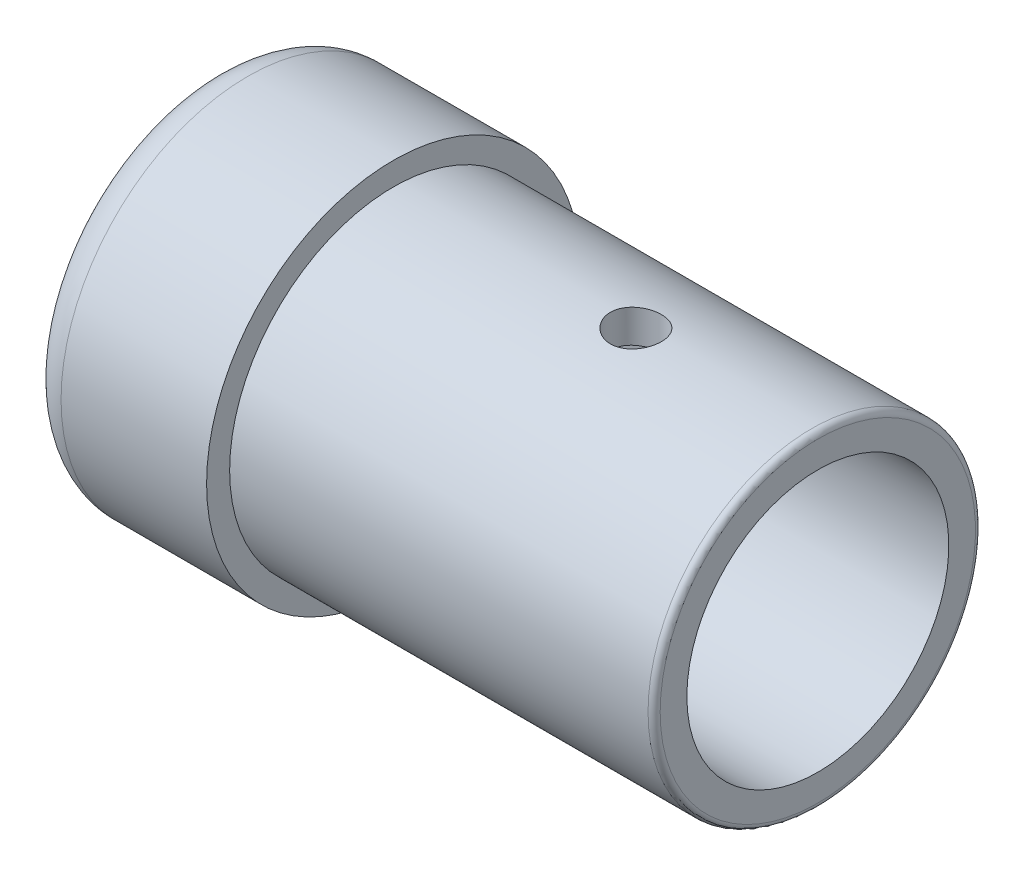
ISO-10303-21;
HEADER;
FILE_DESCRIPTION(('STEP AP214'),'2;1');
FILE_NAME('part.step','',(''),(''),'','','');
FILE_SCHEMA(('AUTOMOTIVE_DESIGN { 1 0 10303 214 1 1 1 1 }'));
ENDSEC;
DATA;
#1=APPLICATION_CONTEXT('core data for automotive mechanical design processes');
#2=APPLICATION_PROTOCOL_DEFINITION('international standard','automotive_design',2000,#1);
#3=PRODUCT_CONTEXT('',#1,'mechanical');
#4=PRODUCT('Part','Part','',(#3));
#5=PRODUCT_RELATED_PRODUCT_CATEGORY('part','',(#4));
#6=PRODUCT_DEFINITION_FORMATION('','',#4);
#7=PRODUCT_DEFINITION_CONTEXT('part definition',#1,'design');
#8=PRODUCT_DEFINITION('design','',#6,#7);
#9=PRODUCT_DEFINITION_SHAPE('','',#8);
#10=(LENGTH_UNIT() NAMED_UNIT(*) SI_UNIT(.MILLI.,.METRE.));
#11=(NAMED_UNIT(*) PLANE_ANGLE_UNIT() SI_UNIT($,.RADIAN.));
#12=(NAMED_UNIT(*) SI_UNIT($,.STERADIAN.) SOLID_ANGLE_UNIT());
#13=UNCERTAINTY_MEASURE_WITH_UNIT(LENGTH_MEASURE(1.E-05),#10,'distance_accuracy_value','');
#14=(GEOMETRIC_REPRESENTATION_CONTEXT(3) GLOBAL_UNCERTAINTY_ASSIGNED_CONTEXT((#13)) GLOBAL_UNIT_ASSIGNED_CONTEXT((#10,
#11,#12)) REPRESENTATION_CONTEXT('',''));
#15=CARTESIAN_POINT('',(0.,0.,0.));
#16=DIRECTION('',(0.,0.,1.));
#17=DIRECTION('',(1.,0.,0.));
#18=AXIS2_PLACEMENT_3D('',#15,#16,#17);
#19=CARTESIAN_POINT('',(0.,0.,0.));
#20=DIRECTION('',(-1.,0.,0.));
#21=DIRECTION('',(0.,0.,1.));
#22=AXIS2_PLACEMENT_3D('',#19,#20,#21);
#23=CYLINDRICAL_SURFACE('',#22,15.4);
#24=CARTESIAN_POINT('',(3.,0.,0.));
#25=DIRECTION('',(1.,0.,0.));
#26=DIRECTION('',(0.,0.,-1.));
#27=AXIS2_PLACEMENT_3D('',#24,#25,#26);
#28=CIRCLE('',#27,15.4);
#29=CARTESIAN_POINT('',(3.,0.,-15.4));
#30=VERTEX_POINT('',#29);
#31=EDGE_CURVE('E43',#30,#30,#28,.T.);
#32=ORIENTED_EDGE('',*,*,#31,.T.);
#33=EDGE_LOOP('',(#32));
#34=FACE_BOUND('',#33,.T.);
#35=CARTESIAN_POINT('',(15.,0.,0.));
#36=DIRECTION('',(-1.,0.,0.));
#37=DIRECTION('',(0.,0.,1.));
#38=AXIS2_PLACEMENT_3D('',#35,#36,#37);
#39=CIRCLE('',#38,15.4);
#40=CARTESIAN_POINT('',(15.,0.,15.4));
#41=VERTEX_POINT('',#40);
#42=EDGE_CURVE('E52',#41,#41,#39,.T.);
#43=ORIENTED_EDGE('',*,*,#42,.T.);
#44=EDGE_LOOP('',(#43));
#45=FACE_BOUND('',#44,.T.);
#46=ADVANCED_FACE('F32',(#34,#45),#23,.T.);
#47=CARTESIAN_POINT('',(15.,15.4,0.));
#48=DIRECTION('',(-1.,0.,0.));
#49=DIRECTION('',(0.,0.,1.));
#50=AXIS2_PLACEMENT_3D('',#47,#48,#49);
#51=PLANE('',#50);
#52=ORIENTED_EDGE('',*,*,#42,.F.);
#53=EDGE_LOOP('',(#52));
#54=FACE_BOUND('',#53,.T.);
#55=CARTESIAN_POINT('',(15.,0.,0.));
#56=DIRECTION('',(-1.,0.,0.));
#57=DIRECTION('',(0.,0.,1.));
#58=AXIS2_PLACEMENT_3D('',#55,#56,#57);
#59=CIRCLE('',#58,13.5);
#60=CARTESIAN_POINT('',(15.,0.,13.5));
#61=VERTEX_POINT('',#60);
#62=EDGE_CURVE('E120',#61,#61,#59,.T.);
#63=ORIENTED_EDGE('',*,*,#62,.T.);
#64=EDGE_LOOP('',(#63));
#65=FACE_BOUND('',#64,.T.);
#66=ADVANCED_FACE('F93',(#54,#65),#51,.F.);
#67=CARTESIAN_POINT('',(0.,0.,0.));
#68=DIRECTION('',(-1.,0.,0.));
#69=DIRECTION('',(0.,0.,1.));
#70=AXIS2_PLACEMENT_3D('',#67,#68,#69);
#71=CYLINDRICAL_SURFACE('',#70,13.5);
#72=CARTESIAN_POINT('',(49.5,0.,0.));
#73=DIRECTION('',(-1.,0.,0.));
#74=DIRECTION('',(0.,0.,1.));
#75=AXIS2_PLACEMENT_3D('',#72,#73,#74);
#76=CIRCLE('',#75,13.5);
#77=CARTESIAN_POINT('',(49.5,0.,13.5));
#78=VERTEX_POINT('',#77);
#79=EDGE_CURVE('E39',#78,#78,#76,.T.);
#80=ORIENTED_EDGE('',*,*,#79,.T.);
#81=EDGE_LOOP('',(#80));
#82=FACE_BOUND('',#81,.T.);
#83=CARTESIAN_POINT('',(35.,13.3356664625357,-2.1));
#84=CARTESIAN_POINT('',(35.117189735604,13.3356684764629,-2.09999519959793));
#85=CARTESIAN_POINT('',(35.2344462028055,13.3372279268675,-2.09015721642434));
#86=CARTESIAN_POINT('',(35.465677026657,13.3432925416161,-2.05107780489137));
#87=CARTESIAN_POINT('',(35.5796481288863,13.3478005286584,-2.02181778299226));
#88=CARTESIAN_POINT('',(35.8009279355127,13.3592395594915,-1.9447940892651));
#89=CARTESIAN_POINT('',(35.9082418218113,13.3661686901015,-1.89704502421322));
#90=CARTESIAN_POINT('',(36.1133205031741,13.3816670025326,-1.78443372291488));
#91=CARTESIAN_POINT('',(36.2110865330369,13.3902359718524,-1.71957370360874));
#92=CARTESIAN_POINT('',(36.3951492060818,13.4081308443291,-1.57398608279102));
#93=CARTESIAN_POINT('',(36.481351813448,13.4174620642089,-1.49314023241013));
#94=CARTESIAN_POINT('',(36.6390251600435,13.4357826645709,-1.31813128478761));
#95=CARTESIAN_POINT('',(36.7104950693196,13.4447720257716,-1.22396743779231));
#96=CARTESIAN_POINT('',(36.8370231944948,13.4614518932917,-1.02439074618979));
#97=CARTESIAN_POINT('',(36.89199450949,13.4691354327207,-0.918922176013068));
#98=CARTESIAN_POINT('',(36.9834070537758,13.4822789509612,-0.700109239269966));
#99=CARTESIAN_POINT('',(37.0198493345692,13.4877390559467,-0.586765320036194));
#100=CARTESIAN_POINT('',(37.072883439397,13.4957829827297,-0.356388621289866));
#101=CARTESIAN_POINT('',(37.0896329163649,13.4983896363778,-0.239392944572103));
#102=CARTESIAN_POINT('',(37.103295709732,13.5005112757695,-0.00422465874926388));
#103=CARTESIAN_POINT('',(37.1002102079947,13.5000264457186,0.113947879813798));
#104=CARTESIAN_POINT('',(37.0744145713439,13.4960379331515,0.347039057823978));
#105=CARTESIAN_POINT('',(37.0518740638975,13.4925603451456,0.461976979584018));
#106=CARTESIAN_POINT('',(36.9880747900587,13.4830061316606,0.686418970202379));
#107=CARTESIAN_POINT('',(36.9468155127194,13.4769294352365,0.795922890643894));
#108=CARTESIAN_POINT('',(36.8465778846658,13.4628150609524,1.00689899763408));
#109=CARTESIAN_POINT('',(36.7875286128001,13.4547695588628,1.10833694382001));
#110=CARTESIAN_POINT('',(36.6534390237683,13.4376133456367,1.29992834978442));
#111=CARTESIAN_POINT('',(36.5783975759204,13.4285025592028,1.39008101095273));
#112=CARTESIAN_POINT('',(36.4135101500281,13.4101172159243,1.55754339927777));
#113=CARTESIAN_POINT('',(36.3235160195746,13.4008419460428,1.63470724571713));
#114=CARTESIAN_POINT('',(36.1317798328264,13.3832667330477,1.77286113616215));
#115=CARTESIAN_POINT('',(36.0300376934507,13.3749667968324,1.83385106577687));
#116=CARTESIAN_POINT('',(35.8175360120414,13.3602820072402,1.93794842666183));
#117=CARTESIAN_POINT('',(35.7067685954084,13.35389884951,1.98104003731286));
#118=CARTESIAN_POINT('',(35.4794468523017,13.3437996863973,2.04796640497384));
#119=CARTESIAN_POINT('',(35.3628929668382,13.3400834780884,2.07180262713114));
#120=CARTESIAN_POINT('',(35.128607101942,13.3357777220034,2.09933980557244));
#121=CARTESIAN_POINT('',(35.0109000434992,13.3351560061604,2.10324793018511));
#122=CARTESIAN_POINT('',(34.7765124868389,13.3370241346911,2.09136844891265));
#123=CARTESIAN_POINT('',(34.6598319544055,13.3395138749563,2.0755815020203));
#124=CARTESIAN_POINT('',(34.4314566258007,13.3472947798028,2.02493601919358));
#125=CARTESIAN_POINT('',(34.3197382151386,13.3525706727344,1.990181415659));
#126=CARTESIAN_POINT('',(34.1037121524504,13.3653167579615,1.90269557401591));
#127=CARTESIAN_POINT('',(33.9994048919868,13.3727870660904,1.84996338692746));
#128=CARTESIAN_POINT('',(33.800235496057,13.3891557174961,1.72752434394179));
#129=CARTESIAN_POINT('',(33.7054564594899,13.3980651083507,1.65768381533106));
#130=CARTESIAN_POINT('',(33.5288897512542,13.4162751014589,1.50319566958544));
#131=CARTESIAN_POINT('',(33.4471028721151,13.4255757275342,1.41854714981526));
#132=CARTESIAN_POINT('',(33.2980940780877,13.4436211750357,1.23593174294203));
#133=CARTESIAN_POINT('',(33.2310097378397,13.4523602469468,1.13785194619521));
#134=CARTESIAN_POINT('',(33.1142704480018,13.4682076691497,0.931694641846686));
#135=CARTESIAN_POINT('',(33.0646149927112,13.4753160667536,0.823617424436053));
#136=CARTESIAN_POINT('',(32.9843609871612,13.4870760908453,0.600955991175807));
#137=CARTESIAN_POINT('',(32.9536882596847,13.4917372691509,0.486399036976263));
#138=CARTESIAN_POINT('',(32.912030707338,13.4981178557191,0.253682269825854));
#139=CARTESIAN_POINT('',(32.9010444796463,13.4998374735912,0.135522714199612));
#140=CARTESIAN_POINT('',(32.8991080008305,13.5001388070407,-0.099712925338461));
#141=CARTESIAN_POINT('',(32.907947633607,13.4987534297219,-0.216787291316591));
#142=CARTESIAN_POINT('',(32.9449602577363,13.4930670527542,-0.44776296436073));
#143=CARTESIAN_POINT('',(32.9731331731387,13.4887660645594,-0.56166428389017));
#144=CARTESIAN_POINT('',(33.0479360994434,13.4777296239122,-0.782995626198468));
#145=CARTESIAN_POINT('',(33.0945504852873,13.4709962328008,-0.890431038845462));
#146=CARTESIAN_POINT('',(33.2048904359269,13.4558330922712,-1.09598847992378));
#147=CARTESIAN_POINT('',(33.2686166398775,13.4474032794918,-1.19411016028639));
#148=CARTESIAN_POINT('',(33.4121262954108,13.4296774256487,-1.37931827466814));
#149=CARTESIAN_POINT('',(33.4920644928839,13.4203735395221,-1.4662840637457));
#150=CARTESIAN_POINT('',(33.6654034744333,13.4020049598849,-1.62564278586229));
#151=CARTESIAN_POINT('',(33.7588074103285,13.3929403229627,-1.69803229761369));
#152=CARTESIAN_POINT('',(33.957096350925,13.3760173591317,-1.82658185565832));
#153=CARTESIAN_POINT('',(34.0620476790476,13.3681666980264,-1.88264059823641));
#154=CARTESIAN_POINT('',(34.2799514951661,13.3546506431588,-1.97624956688431));
#155=CARTESIAN_POINT('',(34.3928956425808,13.348983010056,-2.01381877049071));
#156=CARTESIAN_POINT('',(34.5886049565559,13.3417673387996,-2.0609735452431));
#157=CARTESIAN_POINT('',(34.670168674882,13.3394918286961,-2.07558572704654));
#158=CARTESIAN_POINT('',(34.8344771751545,13.3364406901779,-2.09510057932092));
#159=CARTESIAN_POINT('',(34.91722193993,13.3356650399795,-2.10000339080866));
#160=CARTESIAN_POINT('',(35.,13.3356664625357,-2.1));
#161=B_SPLINE_CURVE_WITH_KNOTS('',3,(#83,#84,#85,#86,#87,#88,#89,#90,#91,#92,#93,#94,#95,#96,
#97,#98,#99,#100,#101,#102,#103,#104,#105,#106,#107,#108,#109,#110,#111,#112,#113,#114,#115,
#116,#117,#118,#119,#120,#121,#122,#123,#124,#125,#126,#127,#128,#129,#130,#131,#132,#133,#134,
#135,#136,#137,#138,#139,#140,#141,#142,#143,#144,#145,#146,#147,#148,#149,#150,#151,#152,#153,
#154,#155,#156,#157,#158,#159,#160),.UNSPECIFIED.,.T.,.F.,(4,2,2,2,2,2,2,2,2,2,2,2,2,2,2,2,2,2,
2,2,2,2,2,2,2,2,2,2,2,2,2,2,2,2,2,2,2,2,4),(0.,0.351266599207078,0.702869966744891,
1.05419612428777,1.40547678542395,1.75946027678429,2.11346370403647,2.46930026272308,
2.82511662581301,3.17806463478201,3.53099161360464,3.8808721674886,4.23076227227304,
4.58206612451967,4.93339482296386,5.28843846180779,5.64348461165128,5.99884392818779,
6.35417620279714,6.70580687570304,7.05742578343908,7.40713707802707,7.75686683563084,
8.10942154382939,8.46199774983106,8.81774417853063,9.17348028436133,9.5278173848218,
9.88212923490819,10.23270382239,10.5832770326532,10.9335538437979,11.2838437401845,
11.6376494763732,11.9915381599271,12.3475775059688,12.703250649535,12.9513746837741,
13.199495114287),.UNSPECIFIED.);
#162=CARTESIAN_POINT('',(35.,13.3356664625357,-2.1));
#163=VERTEX_POINT('',#162);
#164=EDGE_CURVE('E53',#163,#163,#161,.T.);
#165=ORIENTED_EDGE('',*,*,#164,.T.);
#166=EDGE_LOOP('',(#165));
#167=FACE_BOUND('',#166,.T.);
#168=ORIENTED_EDGE('',*,*,#62,.F.);
#169=EDGE_LOOP('',(#168));
#170=FACE_BOUND('',#169,.T.);
#171=ADVANCED_FACE('F63',(#82,#167,#170),#71,.T.);
#172=CARTESIAN_POINT('',(50.,13.5,0.));
#173=DIRECTION('',(-1.,0.,0.));
#174=DIRECTION('',(0.,0.,1.));
#175=AXIS2_PLACEMENT_3D('',#172,#173,#174);
#176=PLANE('',#175);
#177=CARTESIAN_POINT('',(50.,0.,0.));
#178=DIRECTION('',(-1.,0.,0.));
#179=DIRECTION('',(0.,0.,1.));
#180=AXIS2_PLACEMENT_3D('',#177,#178,#179);
#181=CIRCLE('',#180,13.);
#182=CARTESIAN_POINT('',(50.,0.,13.));
#183=VERTEX_POINT('',#182);
#184=EDGE_CURVE('E10',#183,#183,#181,.F.);
#185=ORIENTED_EDGE('',*,*,#184,.T.);
#186=EDGE_LOOP('',(#185));
#187=FACE_BOUND('',#186,.T.);
#188=CARTESIAN_POINT('',(50.,0.,0.));
#189=DIRECTION('',(-1.,0.,0.));
#190=DIRECTION('',(0.,0.,1.));
#191=AXIS2_PLACEMENT_3D('',#188,#189,#190);
#192=CIRCLE('',#191,10.8);
#193=CARTESIAN_POINT('',(50.,0.,10.8));
#194=VERTEX_POINT('',#193);
#195=EDGE_CURVE('E118',#194,#194,#192,.T.);
#196=ORIENTED_EDGE('',*,*,#195,.T.);
#197=EDGE_LOOP('',(#196));
#198=FACE_BOUND('',#197,.T.);
#199=ADVANCED_FACE('F87',(#187,#198),#176,.F.);
#200=CARTESIAN_POINT('',(0.,0.,0.));
#201=DIRECTION('',(-1.,0.,0.));
#202=DIRECTION('',(0.,0.,1.));
#203=AXIS2_PLACEMENT_3D('',#200,#201,#202);
#204=CYLINDRICAL_SURFACE('',#203,10.8);
#205=CARTESIAN_POINT('',(35.,10.5938661498057,-2.1));
#206=CARTESIAN_POINT('',(34.8832447043267,10.5938684468206,-2.09999560822055));
#207=CARTESIAN_POINT('',(34.7664333501792,10.5958172688375,-2.09022994600215));
#208=CARTESIAN_POINT('',(34.5361103120214,10.6033913317098,-2.05145505966835));
#209=CARTESIAN_POINT('',(34.4226014201228,10.6090195941646,-2.02243001923394));
#210=CARTESIAN_POINT('',(34.2022489888691,10.623291547118,-1.9460663735942));
#211=CARTESIAN_POINT('',(34.0953991258295,10.6319323237447,-1.89874546037558));
#212=CARTESIAN_POINT('',(33.8911596440697,10.6512522497934,-1.78718107341206));
#213=CARTESIAN_POINT('',(33.7937694032348,10.6619312650328,-1.72293871354348));
#214=CARTESIAN_POINT('',(33.6099051653556,10.6842839553348,-1.57843920677243));
#215=CARTESIAN_POINT('',(33.5235760766462,10.6959680223641,-1.49799925431501));
#216=CARTESIAN_POINT('',(33.3655486412484,10.7189227087417,-1.3237829802565));
#217=CARTESIAN_POINT('',(33.2938512903491,10.7301932999075,-1.23000575169973));
#218=CARTESIAN_POINT('',(33.1665634104725,10.7511628865184,-1.0308208239614));
#219=CARTESIAN_POINT('',(33.1111101016246,10.76084820419,-0.925323871775643));
#220=CARTESIAN_POINT('',(33.0187692508195,10.7774394211513,-0.706290719341666));
#221=CARTESIAN_POINT('',(32.9818800668488,10.7843455662506,-0.592755231122893));
#222=CARTESIAN_POINT('',(32.9281643589171,10.7945268932802,-0.36237073269978));
#223=CARTESIAN_POINT('',(32.9110933214132,10.7978462917815,-0.245580718968054));
#224=CARTESIAN_POINT('',(32.8967360727932,10.8006326914423,-0.0107503411501804));
#225=CARTESIAN_POINT('',(32.8994480553796,10.8001000443146,0.107289907799975));
#226=CARTESIAN_POINT('',(32.9243934731736,10.79527676178,0.339591351145529));
#227=CARTESIAN_POINT('',(32.9463635737466,10.791036821673,0.453882028667302));
#228=CARTESIAN_POINT('',(33.0087844338245,10.7793323833902,0.67712299319635));
#229=CARTESIAN_POINT('',(33.0492359035739,10.7718677612895,0.786073074784775));
#230=CARTESIAN_POINT('',(33.1477183256243,10.7544686008737,0.996297078440109));
#231=CARTESIAN_POINT('',(33.2058533936337,10.7445194985499,1.09752097138231));
#232=CARTESIAN_POINT('',(33.3379758781375,10.7232497406752,1.28887461569435));
#233=CARTESIAN_POINT('',(33.4119650232382,10.7119289356229,1.37900315562398));
#234=CARTESIAN_POINT('',(33.5751429588872,10.6889476133512,1.54716931126051));
#235=CARTESIAN_POINT('',(33.6645621792721,10.6772845723874,1.62498314986186));
#236=CARTESIAN_POINT('',(33.8552974635169,10.6551108908498,1.76454540268543));
#237=CARTESIAN_POINT('',(33.9566137284421,10.6446002697581,1.82629354533323));
#238=CARTESIAN_POINT('',(34.168577311466,10.6259170878346,1.93204270982124));
#239=CARTESIAN_POINT('',(34.2792422939923,10.6177490873609,1.97600918354478));
#240=CARTESIAN_POINT('',(34.5065837575897,10.6047441310571,2.04466011695216));
#241=CARTESIAN_POINT('',(34.6232594998614,10.5999067668941,2.06934694035299));
#242=CARTESIAN_POINT('',(34.857286949947,10.5941921356913,2.09840685275935));
#243=CARTESIAN_POINT('',(34.9745971321182,10.593252023339,2.10310234667379));
#244=CARTESIAN_POINT('',(35.2083248756996,10.5952698813066,2.09291237436757));
#245=CARTESIAN_POINT('',(35.324742484451,10.5982276434281,2.07802795397497));
#246=CARTESIAN_POINT('',(35.5523074839195,10.6076492736427,2.02937808951756));
#247=CARTESIAN_POINT('',(35.6634928204036,10.61408141036,1.99578344052717));
#248=CARTESIAN_POINT('',(35.8786566677742,10.6296994456623,1.91084873521463));
#249=CARTESIAN_POINT('',(35.9826346121947,10.6388855603951,1.85950728597452));
#250=CARTESIAN_POINT('',(36.1818472175593,10.6591185658896,1.73980104397897));
#251=CARTESIAN_POINT('',(36.2769578950417,10.670187057077,1.67123364181796));
#252=CARTESIAN_POINT('',(36.4544405478297,10.6928777384075,1.51929335959752));
#253=CARTESIAN_POINT('',(36.5368112857448,10.7044999821917,1.43591904307623));
#254=CARTESIAN_POINT('',(36.6876901520807,10.7271916910936,1.25528761191113));
#255=CARTESIAN_POINT('',(36.7559808123596,10.7382507443106,1.15784733193881));
#256=CARTESIAN_POINT('',(36.8752219899579,10.7583916399462,0.952689615997969));
#257=CARTESIAN_POINT('',(36.9261732090054,10.7674735623741,0.844972596155557));
#258=CARTESIAN_POINT('',(37.0089683302485,10.7825923073231,0.622903936510843));
#259=CARTESIAN_POINT('',(37.0409165484166,10.7886457249624,0.508592369154528));
#260=CARTESIAN_POINT('',(37.0851304099908,10.797096409738,0.276096421270991));
#261=CARTESIAN_POINT('',(37.0973982881541,10.7994940919916,0.157912482017738));
#262=CARTESIAN_POINT('',(37.1018206258292,10.8003540420902,-0.0768924740772234));
#263=CARTESIAN_POINT('',(37.0943027104416,10.798880414157,-0.193507210791278));
#264=CARTESIAN_POINT('',(37.0600876195664,10.7922973910144,-0.42377796313233));
#265=CARTESIAN_POINT('',(37.0333906586558,10.7871880364819,-0.537434011846669));
#266=CARTESIAN_POINT('',(36.9617175464846,10.7739086315547,-0.758370941247683));
#267=CARTESIAN_POINT('',(36.9167787383685,10.7657448366057,-0.865664335797819));
#268=CARTESIAN_POINT('',(36.8099380029991,10.747237701296,-1.07123585007287));
#269=CARTESIAN_POINT('',(36.7480348261466,10.7368942003906,-1.16951330496959));
#270=CARTESIAN_POINT('',(36.6079071810737,10.7149669317118,-1.35588891711595));
#271=CARTESIAN_POINT('',(36.529447270102,10.7033665952143,-1.44380812613493));
#272=CARTESIAN_POINT('',(36.3589193152641,10.6803342430238,-1.60534560384346));
#273=CARTESIAN_POINT('',(36.2668480642079,10.6689022677012,-1.67896049257147));
#274=CARTESIAN_POINT('',(36.0705993281911,10.6473746018214,-1.81050094652378));
#275=CARTESIAN_POINT('',(35.9663092094528,10.6372935361524,-1.86826095404114));
#276=CARTESIAN_POINT('',(35.7493397578078,10.6197864914776,-1.96534683227131));
#277=CARTESIAN_POINT('',(35.6366682872407,10.6123580611232,-2.00468973307872));
#278=CARTESIAN_POINT('',(35.4364217547157,10.6025101706531,-2.05602921966589));
#279=CARTESIAN_POINT('',(35.3500028279312,10.599288370545,-2.07248932506635));
#280=CARTESIAN_POINT('',(35.1757331580228,10.5949655285633,-2.09447619832186));
#281=CARTESIAN_POINT('',(35.0878824594505,10.5938644208279,-2.10000330572054));
#282=CARTESIAN_POINT('',(35.,10.5938661498057,-2.1));
#283=B_SPLINE_CURVE_WITH_KNOTS('',3,(#205,#206,#207,#208,#209,#210,#211,#212,#213,#214,#215,
#216,#217,#218,#219,#220,#221,#222,#223,#224,#225,#226,#227,#228,#229,#230,#231,#232,#233,#234,
#235,#236,#237,#238,#239,#240,#241,#242,#243,#244,#245,#246,#247,#248,#249,#250,#251,#252,#253,
#254,#255,#256,#257,#258,#259,#260,#261,#262,#263,#264,#265,#266,#267,#268,#269,#270,#271,#272,
#273,#274,#275,#276,#277,#278,#279,#280,#281,#282),.UNSPECIFIED.,.T.,.F.,(4,2,2,2,2,2,2,2,2,2,2,
2,2,2,2,2,2,2,2,2,2,2,2,2,2,2,2,2,2,2,2,2,2,2,2,2,2,2,4),(0.,0.349944186671367,0.70017611318036,
1.05007021139372,1.39994128312466,1.75400788300885,2.10809857149928,2.46509942613245,
2.82206869816486,3.17458528647331,3.52706968849835,3.87480812953451,4.22255993538436,
4.57240018605998,4.92227860004326,5.27792395406124,5.63357531951525,5.98991440051558,
6.34620978689439,6.69673681737401,7.04724512580456,7.39460507892489,7.7419923019652,
8.09367420775943,8.44539024989492,8.80218759751091,9.15897050380273,9.51377634769315,
9.86854189954451,10.2174701346298,10.5663944659336,10.9146080828108,11.2628473560783,
11.6164199504186,11.9700759889482,12.3272954301895,12.684183898883,12.9475973122186,
13.2110025446556),.UNSPECIFIED.);
#284=CARTESIAN_POINT('',(35.,10.5938661498057,-2.1));
#285=VERTEX_POINT('',#284);
#286=EDGE_CURVE('E61',#285,#285,#283,.T.);
#287=ORIENTED_EDGE('',*,*,#286,.T.);
#288=EDGE_LOOP('',(#287));
#289=FACE_BOUND('',#288,.T.);
#290=ORIENTED_EDGE('',*,*,#195,.F.);
#291=EDGE_LOOP('',(#290));
#292=FACE_BOUND('',#291,.T.);
#293=CARTESIAN_POINT('',(0.,0.,0.));
#294=DIRECTION('',(-1.,0.,0.));
#295=DIRECTION('',(0.,0.,1.));
#296=AXIS2_PLACEMENT_3D('',#293,#294,#295);
#297=CIRCLE('',#296,10.8);
#298=CARTESIAN_POINT('',(0.,0.,10.8));
#299=VERTEX_POINT('',#298);
#300=EDGE_CURVE('E82',#299,#299,#297,.T.);
#301=ORIENTED_EDGE('',*,*,#300,.T.);
#302=EDGE_LOOP('',(#301));
#303=FACE_BOUND('',#302,.T.);
#304=ADVANCED_FACE('F84',(#289,#292,#303),#204,.F.);
#305=CARTESIAN_POINT('',(0.,10.8,0.));
#306=DIRECTION('',(1.,0.,0.));
#307=DIRECTION('',(0.,0.,-1.));
#308=AXIS2_PLACEMENT_3D('',#305,#306,#307);
#309=PLANE('',#308);
#310=CARTESIAN_POINT('',(0.,0.,0.));
#311=DIRECTION('',(1.,0.,0.));
#312=DIRECTION('',(0.,0.,-1.));
#313=AXIS2_PLACEMENT_3D('',#310,#311,#312);
#314=CIRCLE('',#313,12.4);
#315=CARTESIAN_POINT('',(0.,0.,-12.4));
#316=VERTEX_POINT('',#315);
#317=EDGE_CURVE('E47',#316,#316,#314,.F.);
#318=ORIENTED_EDGE('',*,*,#317,.T.);
#319=EDGE_LOOP('',(#318));
#320=FACE_BOUND('',#319,.T.);
#321=ORIENTED_EDGE('',*,*,#300,.F.);
#322=EDGE_LOOP('',(#321));
#323=FACE_BOUND('',#322,.T.);
#324=ADVANCED_FACE('F72',(#320,#323),#309,.F.);
#325=CARTESIAN_POINT('',(35.,0.,0.));
#326=DIRECTION('',(0.,-1.,0.));
#327=DIRECTION('',(0.,0.,-1.));
#328=AXIS2_PLACEMENT_3D('',#325,#326,#327);
#329=CYLINDRICAL_SURFACE('',#328,2.1);
#330=ORIENTED_EDGE('',*,*,#164,.F.);
#331=EDGE_LOOP('',(#330));
#332=FACE_BOUND('',#331,.T.);
#333=ORIENTED_EDGE('',*,*,#286,.F.);
#334=EDGE_LOOP('',(#333));
#335=FACE_BOUND('',#334,.T.);
#336=ADVANCED_FACE('F67',(#332,#335),#329,.F.);
#337=CARTESIAN_POINT('',(3.,0.,0.));
#338=DIRECTION('',(1.,0.,0.));
#339=DIRECTION('',(0.,0.,-1.));
#340=AXIS2_PLACEMENT_3D('',#337,#338,#339);
#341=TOROIDAL_SURFACE('',#340,12.4,3.);
#342=ORIENTED_EDGE('',*,*,#31,.F.);
#343=EDGE_LOOP('',(#342));
#344=FACE_BOUND('',#343,.T.);
#345=ORIENTED_EDGE('',*,*,#317,.F.);
#346=EDGE_LOOP('',(#345));
#347=FACE_BOUND('',#346,.T.);
#348=ADVANCED_FACE('F71',(#344,#347),#341,.T.);
#349=CARTESIAN_POINT('',(49.5,0.,0.));
#350=DIRECTION('',(-1.,0.,0.));
#351=DIRECTION('',(0.,0.,1.));
#352=AXIS2_PLACEMENT_3D('',#349,#350,#351);
#353=TOROIDAL_SURFACE('',#352,13.,0.5);
#354=ORIENTED_EDGE('',*,*,#184,.F.);
#355=EDGE_LOOP('',(#354));
#356=FACE_BOUND('',#355,.T.);
#357=ORIENTED_EDGE('',*,*,#79,.F.);
#358=EDGE_LOOP('',(#357));
#359=FACE_BOUND('',#358,.T.);
#360=ADVANCED_FACE('F34',(#356,#359),#353,.T.);
#361=CLOSED_SHELL('',(#46,#66,#171,#199,#304,#324,#336,#348,#360));
#362=MANIFOLD_SOLID_BREP('B2',#361);
#363=ADVANCED_BREP_SHAPE_REPRESENTATION('',(#18,#362),#14);
#364=SHAPE_DEFINITION_REPRESENTATION(#9,#363);
ENDSEC;
END-ISO-10303-21;
